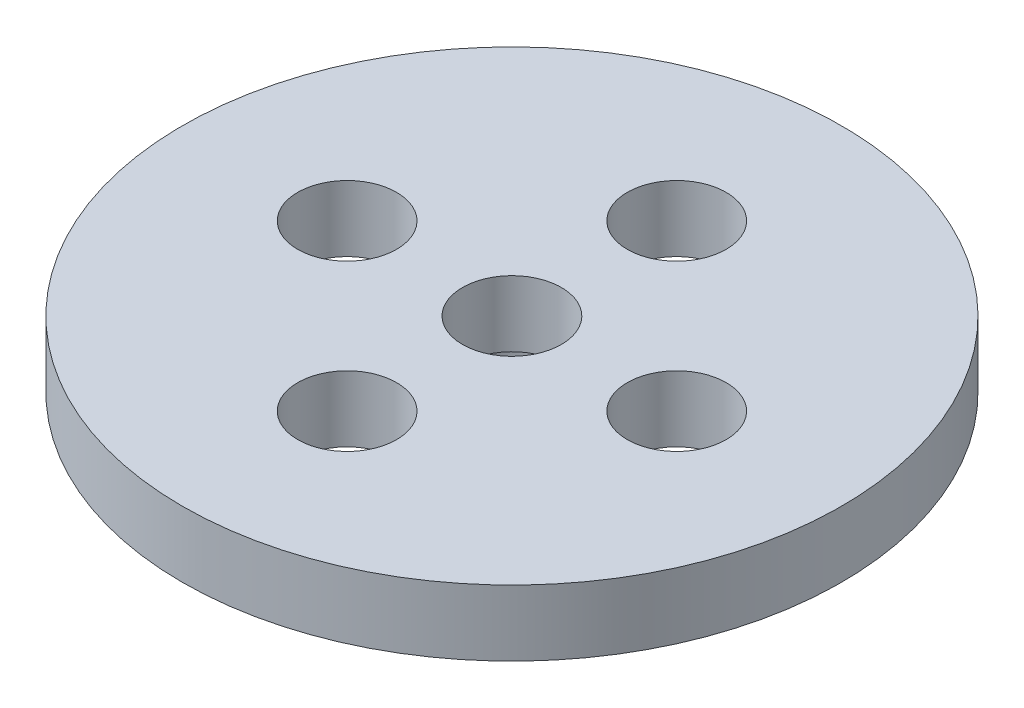
ISO-10303-21;
HEADER;
FILE_DESCRIPTION(('STEP AP214'),'2;1');
FILE_NAME('part.step','',(''),(''),'','','');
FILE_SCHEMA(('AUTOMOTIVE_DESIGN { 1 0 10303 214 1 1 1 1 }'));
ENDSEC;
DATA;
#1=APPLICATION_CONTEXT('core data for automotive mechanical design processes');
#2=APPLICATION_PROTOCOL_DEFINITION('international standard','automotive_design',2000,#1);
#3=PRODUCT_CONTEXT('',#1,'mechanical');
#4=PRODUCT('Part','Part','',(#3));
#5=PRODUCT_RELATED_PRODUCT_CATEGORY('part','',(#4));
#6=PRODUCT_DEFINITION_FORMATION('','',#4);
#7=PRODUCT_DEFINITION_CONTEXT('part definition',#1,'design');
#8=PRODUCT_DEFINITION('design','',#6,#7);
#9=PRODUCT_DEFINITION_SHAPE('','',#8);
#10=(LENGTH_UNIT() NAMED_UNIT(*) SI_UNIT(.MILLI.,.METRE.));
#11=(NAMED_UNIT(*) PLANE_ANGLE_UNIT() SI_UNIT($,.RADIAN.));
#12=(NAMED_UNIT(*) SI_UNIT($,.STERADIAN.) SOLID_ANGLE_UNIT());
#13=UNCERTAINTY_MEASURE_WITH_UNIT(LENGTH_MEASURE(1.E-05),#10,'distance_accuracy_value','');
#14=(GEOMETRIC_REPRESENTATION_CONTEXT(3) GLOBAL_UNCERTAINTY_ASSIGNED_CONTEXT((#13)) GLOBAL_UNIT_ASSIGNED_CONTEXT((#10,
#11,#12)) REPRESENTATION_CONTEXT('',''));
#15=CARTESIAN_POINT('',(0.,0.,0.));
#16=DIRECTION('',(0.,0.,1.));
#17=DIRECTION('',(1.,0.,0.));
#18=AXIS2_PLACEMENT_3D('',#15,#16,#17);
#19=CARTESIAN_POINT('',(-0.153619206484825,0.,-0.0841943370739847));
#20=DIRECTION('',(0.,1.,0.));
#21=DIRECTION('',(0.,0.,1.));
#22=AXIS2_PLACEMENT_3D('',#19,#20,#21);
#23=PLANE('',#22);
#24=CARTESIAN_POINT('',(4.84638079351518,0.,-0.0841943370739847));
#25=DIRECTION('',(0.,1.,0.));
#26=DIRECTION('',(0.,0.,1.));
#27=AXIS2_PLACEMENT_3D('',#24,#25,#26);
#28=CIRCLE('',#27,1.5);
#29=CARTESIAN_POINT('',(4.84638079351518,0.,1.41580566292602));
#30=VERTEX_POINT('',#29);
#31=EDGE_CURVE('E67',#30,#30,#28,.T.);
#32=ORIENTED_EDGE('',*,*,#31,.T.);
#33=EDGE_LOOP('',(#32));
#34=FACE_BOUND('',#33,.T.);
#35=CARTESIAN_POINT('',(-0.153619206484817,0.,-5.08419433707398));
#36=DIRECTION('',(0.,1.,0.));
#37=DIRECTION('',(0.,0.,1.));
#38=AXIS2_PLACEMENT_3D('',#35,#36,#37);
#39=CIRCLE('',#38,1.5);
#40=CARTESIAN_POINT('',(-0.153619206484817,0.,-3.58419433707398));
#41=VERTEX_POINT('',#40);
#42=EDGE_CURVE('E55',#41,#41,#39,.T.);
#43=ORIENTED_EDGE('',*,*,#42,.T.);
#44=EDGE_LOOP('',(#43));
#45=FACE_BOUND('',#44,.T.);
#46=CARTESIAN_POINT('',(-0.153619206484825,0.,-0.0841943370739847));
#47=DIRECTION('',(0.,1.,0.));
#48=DIRECTION('',(0.,0.,1.));
#49=AXIS2_PLACEMENT_3D('',#46,#47,#48);
#50=CIRCLE('',#49,10.);
#51=CARTESIAN_POINT('',(-0.153619206484825,0.,9.91580566292602));
#52=VERTEX_POINT('',#51);
#53=EDGE_CURVE('E42',#52,#52,#50,.T.);
#54=ORIENTED_EDGE('',*,*,#53,.F.);
#55=EDGE_LOOP('',(#54));
#56=FACE_BOUND('',#55,.T.);
#57=CARTESIAN_POINT('',(-5.15361920648482,0.,-0.0841943370739847));
#58=DIRECTION('',(0.,1.,0.));
#59=DIRECTION('',(0.,0.,1.));
#60=AXIS2_PLACEMENT_3D('',#57,#58,#59);
#61=CIRCLE('',#60,1.5);
#62=CARTESIAN_POINT('',(-5.15361920648482,0.,1.41580566292602));
#63=VERTEX_POINT('',#62);
#64=EDGE_CURVE('E61',#63,#63,#61,.T.);
#65=ORIENTED_EDGE('',*,*,#64,.T.);
#66=EDGE_LOOP('',(#65));
#67=FACE_BOUND('',#66,.T.);
#68=CARTESIAN_POINT('',(-0.153619206484817,0.,4.91580566292602));
#69=DIRECTION('',(0.,1.,0.));
#70=DIRECTION('',(0.,0.,1.));
#71=AXIS2_PLACEMENT_3D('',#68,#69,#70);
#72=CIRCLE('',#71,1.5);
#73=CARTESIAN_POINT('',(-0.153619206484817,0.,6.41580566292602));
#74=VERTEX_POINT('',#73);
#75=EDGE_CURVE('E73',#74,#74,#72,.T.);
#76=ORIENTED_EDGE('',*,*,#75,.T.);
#77=EDGE_LOOP('',(#76));
#78=FACE_BOUND('',#77,.T.);
#79=CARTESIAN_POINT('',(-0.153619206484825,0.,-0.0841943370739847));
#80=DIRECTION('',(0.,1.,0.));
#81=DIRECTION('',(0.,0.,1.));
#82=AXIS2_PLACEMENT_3D('',#79,#80,#81);
#83=CIRCLE('',#82,2.5);
#84=CARTESIAN_POINT('',(-0.153619206484825,0.,2.41580566292602));
#85=VERTEX_POINT('',#84);
#86=EDGE_CURVE('E10',#85,#85,#83,.F.);
#87=ORIENTED_EDGE('',*,*,#86,.F.);
#88=EDGE_LOOP('',(#87));
#89=FACE_BOUND('',#88,.T.);
#90=ADVANCED_FACE('F31',(#34,#45,#56,#67,#78,#89),#23,.F.);
#91=CARTESIAN_POINT('',(-0.153619206484825,2.,-0.0841943370739847));
#92=DIRECTION('',(0.,1.,0.));
#93=DIRECTION('',(0.,0.,1.));
#94=AXIS2_PLACEMENT_3D('',#91,#92,#93);
#95=PLANE('',#94);
#96=CARTESIAN_POINT('',(4.84638079351518,2.,-0.0841943370739847));
#97=DIRECTION('',(0.,1.,0.));
#98=DIRECTION('',(0.,0.,1.));
#99=AXIS2_PLACEMENT_3D('',#96,#97,#98);
#100=CIRCLE('',#99,1.5);
#101=CARTESIAN_POINT('',(4.84638079351518,2.,1.41580566292602));
#102=VERTEX_POINT('',#101);
#103=EDGE_CURVE('E64',#102,#102,#100,.T.);
#104=ORIENTED_EDGE('',*,*,#103,.F.);
#105=EDGE_LOOP('',(#104));
#106=FACE_BOUND('',#105,.T.);
#107=CARTESIAN_POINT('',(-0.153619206484817,2.,-5.08419433707398));
#108=DIRECTION('',(0.,1.,0.));
#109=DIRECTION('',(0.,0.,1.));
#110=AXIS2_PLACEMENT_3D('',#107,#108,#109);
#111=CIRCLE('',#110,1.5);
#112=CARTESIAN_POINT('',(-0.153619206484817,2.,-3.58419433707398));
#113=VERTEX_POINT('',#112);
#114=EDGE_CURVE('E52',#113,#113,#111,.T.);
#115=ORIENTED_EDGE('',*,*,#114,.F.);
#116=EDGE_LOOP('',(#115));
#117=FACE_BOUND('',#116,.T.);
#118=CARTESIAN_POINT('',(-0.153619206484825,2.,-0.0841943370739847));
#119=DIRECTION('',(0.,1.,0.));
#120=DIRECTION('',(0.,0.,1.));
#121=AXIS2_PLACEMENT_3D('',#118,#119,#120);
#122=CIRCLE('',#121,10.);
#123=CARTESIAN_POINT('',(-0.153619206484825,2.,9.91580566292602));
#124=VERTEX_POINT('',#123);
#125=EDGE_CURVE('E38',#124,#124,#122,.T.);
#126=ORIENTED_EDGE('',*,*,#125,.T.);
#127=EDGE_LOOP('',(#126));
#128=FACE_BOUND('',#127,.T.);
#129=CARTESIAN_POINT('',(-0.153619206484825,2.,-0.0841943370739847));
#130=DIRECTION('',(0.,1.,0.));
#131=DIRECTION('',(0.,0.,1.));
#132=AXIS2_PLACEMENT_3D('',#129,#130,#131);
#133=CIRCLE('',#132,1.5);
#134=CARTESIAN_POINT('',(-0.153619206484825,2.,1.41580566292602));
#135=VERTEX_POINT('',#134);
#136=EDGE_CURVE('E47',#135,#135,#133,.T.);
#137=ORIENTED_EDGE('',*,*,#136,.F.);
#138=EDGE_LOOP('',(#137));
#139=FACE_BOUND('',#138,.T.);
#140=CARTESIAN_POINT('',(-5.15361920648482,2.,-0.0841943370739847));
#141=DIRECTION('',(0.,1.,0.));
#142=DIRECTION('',(0.,0.,1.));
#143=AXIS2_PLACEMENT_3D('',#140,#141,#142);
#144=CIRCLE('',#143,1.5);
#145=CARTESIAN_POINT('',(-5.15361920648482,2.,1.41580566292602));
#146=VERTEX_POINT('',#145);
#147=EDGE_CURVE('E58',#146,#146,#144,.T.);
#148=ORIENTED_EDGE('',*,*,#147,.F.);
#149=EDGE_LOOP('',(#148));
#150=FACE_BOUND('',#149,.T.);
#151=CARTESIAN_POINT('',(-0.153619206484817,2.,4.91580566292602));
#152=DIRECTION('',(0.,1.,0.));
#153=DIRECTION('',(0.,0.,1.));
#154=AXIS2_PLACEMENT_3D('',#151,#152,#153);
#155=CIRCLE('',#154,1.5);
#156=CARTESIAN_POINT('',(-0.153619206484817,2.,6.41580566292602));
#157=VERTEX_POINT('',#156);
#158=EDGE_CURVE('E70',#157,#157,#155,.T.);
#159=ORIENTED_EDGE('',*,*,#158,.F.);
#160=EDGE_LOOP('',(#159));
#161=FACE_BOUND('',#160,.T.);
#162=ADVANCED_FACE('F108',(#106,#117,#128,#139,#150,#161),#95,.T.);
#163=CARTESIAN_POINT('',(-0.153619206484825,0.,-0.0841943370739847));
#164=DIRECTION('',(0.,-1.,0.));
#165=DIRECTION('',(0.,0.,-1.));
#166=AXIS2_PLACEMENT_3D('',#163,#164,#165);
#167=CIRCLE('',#166,1.72473724142998);
#168=CARTESIAN_POINT('',(-0.153619206484825,0.,-1.80893157850396));
#169=VERTEX_POINT('',#168);
#170=EDGE_CURVE('E82',#169,#169,#167,.T.);
#171=ORIENTED_EDGE('',*,*,#170,.T.);
#172=EDGE_LOOP('',(#171));
#173=FACE_BOUND('',#172,.T.);
#174=CARTESIAN_POINT('',(-0.153619206484825,0.,-0.0841943370739847));
#175=DIRECTION('',(0.,1.,0.));
#176=DIRECTION('',(0.,0.,1.));
#177=AXIS2_PLACEMENT_3D('',#174,#175,#176);
#178=CIRCLE('',#177,1.5);
#179=CARTESIAN_POINT('',(-0.153619206484825,0.,1.41580566292602));
#180=VERTEX_POINT('',#179);
#181=EDGE_CURVE('E49',#180,#180,#178,.T.);
#182=ORIENTED_EDGE('',*,*,#181,.T.);
#183=EDGE_LOOP('',(#182));
#184=FACE_BOUND('',#183,.T.);
#185=ADVANCED_FACE('F110',(#173,#184),#23,.F.);
#186=CARTESIAN_POINT('',(-0.153619206484825,2.,-0.0841943370739847));
#187=DIRECTION('',(0.,-1.,0.));
#188=DIRECTION('',(0.,0.,-1.));
#189=AXIS2_PLACEMENT_3D('',#186,#187,#188);
#190=CYLINDRICAL_SURFACE('',#189,10.);
#191=ORIENTED_EDGE('',*,*,#125,.F.);
#192=EDGE_LOOP('',(#191));
#193=FACE_BOUND('',#192,.T.);
#194=ORIENTED_EDGE('',*,*,#53,.T.);
#195=EDGE_LOOP('',(#194));
#196=FACE_BOUND('',#195,.T.);
#197=ADVANCED_FACE('F33',(#193,#196),#190,.T.);
#198=CARTESIAN_POINT('',(-0.153619206484825,2.,-0.0841943370739847));
#199=DIRECTION('',(0.,-1.,0.));
#200=DIRECTION('',(0.,0.,-1.));
#201=AXIS2_PLACEMENT_3D('',#198,#199,#200);
#202=CYLINDRICAL_SURFACE('',#201,1.5);
#203=ORIENTED_EDGE('',*,*,#136,.T.);
#204=EDGE_LOOP('',(#203));
#205=FACE_BOUND('',#204,.T.);
#206=ORIENTED_EDGE('',*,*,#181,.F.);
#207=EDGE_LOOP('',(#206));
#208=FACE_BOUND('',#207,.T.);
#209=ADVANCED_FACE('F122',(#205,#208),#202,.F.);
#210=CARTESIAN_POINT('',(-0.153619206484817,2.,-5.08419433707398));
#211=DIRECTION('',(0.,-1.,0.));
#212=DIRECTION('',(0.,0.,-1.));
#213=AXIS2_PLACEMENT_3D('',#210,#211,#212);
#214=CYLINDRICAL_SURFACE('',#213,1.5);
#215=ORIENTED_EDGE('',*,*,#114,.T.);
#216=EDGE_LOOP('',(#215));
#217=FACE_BOUND('',#216,.T.);
#218=ORIENTED_EDGE('',*,*,#42,.F.);
#219=EDGE_LOOP('',(#218));
#220=FACE_BOUND('',#219,.T.);
#221=ADVANCED_FACE('F129',(#217,#220),#214,.F.);
#222=CARTESIAN_POINT('',(-5.15361920648482,2.,-0.0841943370739847));
#223=DIRECTION('',(0.,-1.,0.));
#224=DIRECTION('',(0.,0.,-1.));
#225=AXIS2_PLACEMENT_3D('',#222,#223,#224);
#226=CYLINDRICAL_SURFACE('',#225,1.5);
#227=ORIENTED_EDGE('',*,*,#147,.T.);
#228=EDGE_LOOP('',(#227));
#229=FACE_BOUND('',#228,.T.);
#230=ORIENTED_EDGE('',*,*,#64,.F.);
#231=EDGE_LOOP('',(#230));
#232=FACE_BOUND('',#231,.T.);
#233=ADVANCED_FACE('F135',(#229,#232),#226,.F.);
#234=CARTESIAN_POINT('',(4.84638079351518,2.,-0.0841943370739847));
#235=DIRECTION('',(0.,-1.,0.));
#236=DIRECTION('',(0.,0.,-1.));
#237=AXIS2_PLACEMENT_3D('',#234,#235,#236);
#238=CYLINDRICAL_SURFACE('',#237,1.5);
#239=ORIENTED_EDGE('',*,*,#103,.T.);
#240=EDGE_LOOP('',(#239));
#241=FACE_BOUND('',#240,.T.);
#242=ORIENTED_EDGE('',*,*,#31,.F.);
#243=EDGE_LOOP('',(#242));
#244=FACE_BOUND('',#243,.T.);
#245=ADVANCED_FACE('F103',(#241,#244),#238,.F.);
#246=CARTESIAN_POINT('',(-0.153619206484817,2.,4.91580566292602));
#247=DIRECTION('',(0.,-1.,0.));
#248=DIRECTION('',(0.,0.,-1.));
#249=AXIS2_PLACEMENT_3D('',#246,#247,#248);
#250=CYLINDRICAL_SURFACE('',#249,1.5);
#251=ORIENTED_EDGE('',*,*,#158,.T.);
#252=EDGE_LOOP('',(#251));
#253=FACE_BOUND('',#252,.T.);
#254=ORIENTED_EDGE('',*,*,#75,.F.);
#255=EDGE_LOOP('',(#254));
#256=FACE_BOUND('',#255,.T.);
#257=ADVANCED_FACE('F94',(#253,#256),#250,.F.);
#258=CARTESIAN_POINT('',(-0.153619206484825,-2.,-0.0841943370739847));
#259=DIRECTION('',(0.,-1.,0.));
#260=DIRECTION('',(0.,0.,-1.));
#261=AXIS2_PLACEMENT_3D('',#258,#259,#260);
#262=PLANE('',#261);
#263=CARTESIAN_POINT('',(-0.153619206484825,-2.,-0.0841943370739847));
#264=DIRECTION('',(0.,-1.,0.));
#265=DIRECTION('',(0.,0.,-1.));
#266=AXIS2_PLACEMENT_3D('',#263,#264,#265);
#267=CIRCLE('',#266,2.5);
#268=CARTESIAN_POINT('',(-0.153619206484825,-2.,-2.58419433707398));
#269=VERTEX_POINT('',#268);
#270=EDGE_CURVE('E76',#269,#269,#267,.T.);
#271=ORIENTED_EDGE('',*,*,#270,.T.);
#272=EDGE_LOOP('',(#271));
#273=FACE_BOUND('',#272,.T.);
#274=CARTESIAN_POINT('',(-0.153619206484825,-2.,-0.0841943370739847));
#275=DIRECTION('',(0.,-1.,0.));
#276=DIRECTION('',(0.,0.,-1.));
#277=AXIS2_PLACEMENT_3D('',#274,#275,#276);
#278=CIRCLE('',#277,1.72473724142998);
#279=CARTESIAN_POINT('',(-0.153619206484825,-2.,-1.80893157850396));
#280=VERTEX_POINT('',#279);
#281=EDGE_CURVE('E81',#280,#280,#278,.T.);
#282=ORIENTED_EDGE('',*,*,#281,.F.);
#283=EDGE_LOOP('',(#282));
#284=FACE_BOUND('',#283,.T.);
#285=ADVANCED_FACE('F91',(#273,#284),#262,.T.);
#286=CARTESIAN_POINT('',(-0.153619206484825,-2.,-0.0841943370739847));
#287=DIRECTION('',(0.,1.,0.));
#288=DIRECTION('',(0.,0.,1.));
#289=AXIS2_PLACEMENT_3D('',#286,#287,#288);
#290=CYLINDRICAL_SURFACE('',#289,2.5);
#291=ORIENTED_EDGE('',*,*,#270,.F.);
#292=EDGE_LOOP('',(#291));
#293=FACE_BOUND('',#292,.T.);
#294=ORIENTED_EDGE('',*,*,#86,.T.);
#295=EDGE_LOOP('',(#294));
#296=FACE_BOUND('',#295,.T.);
#297=ADVANCED_FACE('F93',(#293,#296),#290,.T.);
#298=CARTESIAN_POINT('',(-0.153619206484825,-2.,-0.0841943370739847));
#299=DIRECTION('',(0.,1.,0.));
#300=DIRECTION('',(0.,0.,1.));
#301=AXIS2_PLACEMENT_3D('',#298,#299,#300);
#302=CYLINDRICAL_SURFACE('',#301,1.72473724142998);
#303=ORIENTED_EDGE('',*,*,#281,.T.);
#304=EDGE_LOOP('',(#303));
#305=FACE_BOUND('',#304,.T.);
#306=ORIENTED_EDGE('',*,*,#170,.F.);
#307=EDGE_LOOP('',(#306));
#308=FACE_BOUND('',#307,.T.);
#309=ADVANCED_FACE('F88',(#305,#308),#302,.F.);
#310=CLOSED_SHELL('',(#90,#162,#185,#197,#209,#221,#233,#245,#257,#285,#297,#309));
#311=MANIFOLD_SOLID_BREP('B2',#310);
#312=ADVANCED_BREP_SHAPE_REPRESENTATION('',(#18,#311),#14);
#313=SHAPE_DEFINITION_REPRESENTATION(#9,#312);
ENDSEC;
END-ISO-10303-21;
